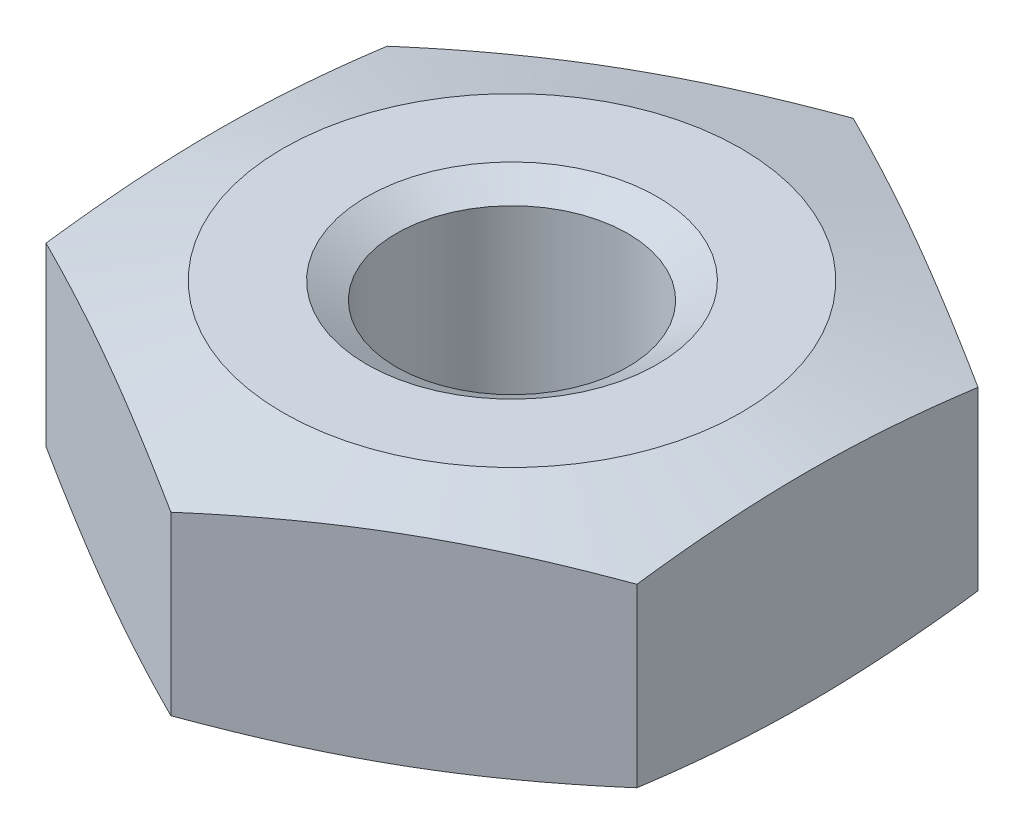
ISO-10303-21;
HEADER;
FILE_DESCRIPTION(('STEP AP214'),'2;1');
FILE_NAME('part.step','',(''),(''),'','','');
FILE_SCHEMA(('AUTOMOTIVE_DESIGN { 1 0 10303 214 1 1 1 1 }'));
ENDSEC;
DATA;
#1=APPLICATION_CONTEXT('core data for automotive mechanical design processes');
#2=APPLICATION_PROTOCOL_DEFINITION('international standard','automotive_design',2000,#1);
#3=PRODUCT_CONTEXT('',#1,'mechanical');
#4=PRODUCT('Part','Part','',(#3));
#5=PRODUCT_RELATED_PRODUCT_CATEGORY('part','',(#4));
#6=PRODUCT_DEFINITION_FORMATION('','',#4);
#7=PRODUCT_DEFINITION_CONTEXT('part definition',#1,'design');
#8=PRODUCT_DEFINITION('design','',#6,#7);
#9=PRODUCT_DEFINITION_SHAPE('','',#8);
#10=(LENGTH_UNIT() NAMED_UNIT(*) SI_UNIT(.MILLI.,.METRE.));
#11=(NAMED_UNIT(*) PLANE_ANGLE_UNIT() SI_UNIT($,.RADIAN.));
#12=(NAMED_UNIT(*) SI_UNIT($,.STERADIAN.) SOLID_ANGLE_UNIT());
#13=UNCERTAINTY_MEASURE_WITH_UNIT(LENGTH_MEASURE(1.E-05),#10,'distance_accuracy_value','');
#14=(GEOMETRIC_REPRESENTATION_CONTEXT(3) GLOBAL_UNCERTAINTY_ASSIGNED_CONTEXT((#13)) GLOBAL_UNIT_ASSIGNED_CONTEXT((#10,
#11,#12)) REPRESENTATION_CONTEXT('',''));
#15=CARTESIAN_POINT('',(0.,0.,0.));
#16=DIRECTION('',(0.,0.,1.));
#17=DIRECTION('',(1.,0.,0.));
#18=AXIS2_PLACEMENT_3D('',#15,#16,#17);
#19=CARTESIAN_POINT('',(2.,-0.8,-1.15470053837923));
#20=DIRECTION('',(-1.,0.,0.));
#21=DIRECTION('',(0.,0.,1.));
#22=AXIS2_PLACEMENT_3D('',#19,#20,#21);
#23=PLANE('',#22);
#24=CARTESIAN_POINT('',(1.99999999999997,0.141401210251661,3.47324861667428));
#25=CARTESIAN_POINT('',(1.99999999999997,0.160940611016028,3.3890936486832));
#26=CARTESIAN_POINT('',(1.99999999999997,0.180315705775737,3.30490054066797));
#27=CARTESIAN_POINT('',(1.99999999999996,0.218666868861422,3.13642208522566));
#28=CARTESIAN_POINT('',(1.99999999999997,0.23764293057746,3.05213673629492));
#29=CARTESIAN_POINT('',(1.99999999999997,0.293873377293213,2.79908926674104));
#30=CARTESIAN_POINT('',(1.99999999999997,0.330422252460475,2.63016894201641));
#31=CARTESIAN_POINT('',(1.99999999999997,0.401121323227892,2.29018152307641));
#32=CARTESIAN_POINT('',(1.99999999999997,0.435246030323585,2.11910908018931));
#33=CARTESIAN_POINT('',(1.99999999999998,0.499358491215547,1.77616039050156));
#34=CARTESIAN_POINT('',(1.99999999999998,0.529345890430285,1.60428407610985));
#35=CARTESIAN_POINT('',(1.99999999999998,0.582395558806895,1.264186479253));
#36=CARTESIAN_POINT('',(1.99999999999998,0.605622705089442,1.09599155406965));
#37=CARTESIAN_POINT('',(1.99999999999998,0.643619993830858,0.758643108449423));
#38=CARTESIAN_POINT('',(1.99999999999999,0.658392810002713,0.589489908180469));
#39=CARTESIAN_POINT('',(1.99999999999999,0.672380698873224,0.335682855885147));
#40=CARTESIAN_POINT('',(1.99999999999999,0.675683040364849,0.251248263840001));
#41=CARTESIAN_POINT('',(1.99999999999999,0.679442523828146,0.0823134970074466));
#42=CARTESIAN_POINT('',(1.99999999999999,0.679899678459578,-0.00218667748647597));
#43=CARTESIAN_POINT('',(1.99999999999999,0.677940099019386,-0.171157278962484));
#44=CARTESIAN_POINT('',(1.99999999999999,0.675523216204663,-0.255627704178596));
#45=CARTESIAN_POINT('',(2.,0.667942025179153,-0.424446461991346));
#46=CARTESIAN_POINT('',(2.,0.662777588436086,-0.508794788691024));
#47=CARTESIAN_POINT('',(2.,0.64719338979575,-0.713370271919349));
#48=CARTESIAN_POINT('',(2.,0.635470294867189,-0.833498119388903));
#49=CARTESIAN_POINT('',(2.,0.607830899802382,-1.07325134848211));
#50=CARTESIAN_POINT('',(2.,0.591914764628074,-1.19287674968486));
#51=CARTESIAN_POINT('',(2.,0.556763765063508,-1.43201365097653));
#52=CARTESIAN_POINT('',(2.,0.53751868779834,-1.55152362763628));
#53=CARTESIAN_POINT('',(2.,0.496531295604209,-1.79011542775252));
#54=CARTESIAN_POINT('',(2.00000000000001,0.474788858313548,-1.90919722993493));
#55=CARTESIAN_POINT('',(2.00000000000001,0.428955102291408,-2.14943338234408));
#56=CARTESIAN_POINT('',(2.00000000000001,0.404824801366345,-2.27058023847957));
#57=CARTESIAN_POINT('',(2.00000000000001,0.355083694392917,-2.51256928405234));
#58=CARTESIAN_POINT('',(2.00000000000001,0.329472872058284,-2.63341147012285));
#59=CARTESIAN_POINT('',(2.00000000000001,0.277268298844412,-2.87420001792743));
#60=CARTESIAN_POINT('',(2.00000000000001,0.250680592994023,-2.99414769646664));
#61=CARTESIAN_POINT('',(2.00000000000002,0.196634477720379,-3.23383822338097));
#62=CARTESIAN_POINT('',(2.00000000000002,0.169176129295292,-3.35358108548895));
#63=CARTESIAN_POINT('',(2.00000000000003,0.141401210251662,-3.47324861667424));
#64=B_SPLINE_CURVE_WITH_KNOTS('',3,(#24,#25,#26,#27,#28,#29,#30,#31,#32,#33,#34,#35,#36,#37,#38,
#39,#40,#41,#42,#43,#44,#45,#46,#47,#48,#49,#50,#51,#52,#53,#54,#55,#56,#57,#58,#59,#60,#61,#62,
#63),.UNSPECIFIED.,.F.,.F.,(4,2,2,2,2,2,2,2,2,2,2,2,2,2,2,2,2,2,2,4),(0.,0.259180308738312,
0.518364907393337,1.03683644692275,1.56013308467464,2.08347454292815,2.59270950514507,
3.10178333080936,3.35523857644573,3.60869269432316,3.86215993005044,4.11563902417542,
4.47763636286725,4.83961946204229,5.20273345223413,5.56586524130659,5.93643310809131,
6.30700505203223,6.67557873146188,7.04412664502861),.UNSPECIFIED.);
#65=CARTESIAN_POINT('',(2.,0.596519094751234,1.15470053837927));
#66=VERTEX_POINT('',#65);
#67=CARTESIAN_POINT('',(2.,0.596519094751236,-1.15470053837924));
#68=VERTEX_POINT('',#67);
#69=EDGE_CURVE('E85',#66,#68,#64,.T.);
#70=ORIENTED_EDGE('',*,*,#69,.F.);
#71=DIRECTION('',(0.,1.,0.));
#72=VECTOR('',#71,1.);
#73=CARTESIAN_POINT('',(2.,-0.8,1.15470053837927));
#74=LINE('',#73,#72);
#75=CARTESIAN_POINT('',(2.,-0.596519094751236,1.15470053837927));
#76=VERTEX_POINT('',#75);
#77=EDGE_CURVE('E11',#76,#66,#74,.T.);
#78=ORIENTED_EDGE('',*,*,#77,.F.);
#79=CARTESIAN_POINT('',(2.00000000000003,-0.141401210251661,-3.47324861667424));
#80=CARTESIAN_POINT('',(2.00000000000002,-0.160940611016028,-3.38909364868317));
#81=CARTESIAN_POINT('',(2.00000000000002,-0.180315705775737,-3.30490054066794));
#82=CARTESIAN_POINT('',(2.00000000000002,-0.218666868861421,-3.13642208522563));
#83=CARTESIAN_POINT('',(2.00000000000001,-0.23764293057746,-3.05213673629489));
#84=CARTESIAN_POINT('',(2.00000000000001,-0.293873377293213,-2.79908926674101));
#85=CARTESIAN_POINT('',(2.00000000000001,-0.330422252460475,-2.63016894201638));
#86=CARTESIAN_POINT('',(2.00000000000001,-0.401121323227891,-2.29018152307638));
#87=CARTESIAN_POINT('',(2.00000000000001,-0.435246030323585,-2.11910908018928));
#88=CARTESIAN_POINT('',(2.,-0.499358491215547,-1.77616039050153));
#89=CARTESIAN_POINT('',(2.,-0.529345890430284,-1.60428407610982));
#90=CARTESIAN_POINT('',(2.,-0.582395558806895,-1.26418647925297));
#91=CARTESIAN_POINT('',(2.,-0.605622705089442,-1.09599155406962));
#92=CARTESIAN_POINT('',(2.,-0.643619993830858,-0.758643108449392));
#93=CARTESIAN_POINT('',(2.,-0.658392810002713,-0.589489908180437));
#94=CARTESIAN_POINT('',(1.99999999999999,-0.672380698873224,-0.335682855885116));
#95=CARTESIAN_POINT('',(1.99999999999999,-0.675683040364849,-0.251248263839969));
#96=CARTESIAN_POINT('',(1.99999999999999,-0.679442523828146,-0.0823134970074147));
#97=CARTESIAN_POINT('',(1.99999999999999,-0.679899678459578,0.00218667748650792));
#98=CARTESIAN_POINT('',(1.99999999999999,-0.677940099019386,0.171157278962516));
#99=CARTESIAN_POINT('',(1.99999999999999,-0.675523216204663,0.255627704178628));
#100=CARTESIAN_POINT('',(1.99999999999999,-0.667942025179153,0.424446461991378));
#101=CARTESIAN_POINT('',(2.,-0.662777588436086,0.508794788691056));
#102=CARTESIAN_POINT('',(2.,-0.64719338979575,0.713370271919381));
#103=CARTESIAN_POINT('',(1.99999999999999,-0.635470294867189,0.833498119388935));
#104=CARTESIAN_POINT('',(1.99999999999998,-0.607830899802382,1.07325134848214));
#105=CARTESIAN_POINT('',(1.99999999999998,-0.591914764628074,1.19287674968489));
#106=CARTESIAN_POINT('',(1.99999999999998,-0.556763765063508,1.43201365097656));
#107=CARTESIAN_POINT('',(1.99999999999998,-0.53751868779834,1.55152362763631));
#108=CARTESIAN_POINT('',(1.99999999999998,-0.49653129560421,1.79011542775255));
#109=CARTESIAN_POINT('',(1.99999999999998,-0.474788858313548,1.90919722993496));
#110=CARTESIAN_POINT('',(1.99999999999997,-0.428955102291408,2.14943338234411));
#111=CARTESIAN_POINT('',(1.99999999999997,-0.404824801366345,2.2705802384796));
#112=CARTESIAN_POINT('',(1.99999999999997,-0.355083694392918,2.51256928405237));
#113=CARTESIAN_POINT('',(1.99999999999997,-0.329472872058284,2.63341147012289));
#114=CARTESIAN_POINT('',(1.99999999999997,-0.277268298844413,2.87420001792746));
#115=CARTESIAN_POINT('',(1.99999999999997,-0.250680592994024,2.99414769646667));
#116=CARTESIAN_POINT('',(1.99999999999997,-0.19663447772038,3.233838223381));
#117=CARTESIAN_POINT('',(1.99999999999997,-0.169176129295292,3.35358108548898));
#118=CARTESIAN_POINT('',(1.99999999999997,-0.141401210251661,3.47324861667428));
#119=B_SPLINE_CURVE_WITH_KNOTS('',3,(#79,#80,#81,#82,#83,#84,#85,#86,#87,#88,#89,#90,#91,#92,
#93,#94,#95,#96,#97,#98,#99,#100,#101,#102,#103,#104,#105,#106,#107,#108,#109,#110,#111,#112,
#113,#114,#115,#116,#117,#118),.UNSPECIFIED.,.F.,.F.,(4,2,2,2,2,2,2,2,2,2,2,2,2,2,2,2,2,2,2,4),
(0.,0.259180308738313,0.518364907393337,1.03683644692275,1.56013308467464,2.08347454292815,
2.59270950514507,3.10178333080936,3.35523857644573,3.60869269432316,3.86215993005044,
4.11563902417542,4.47763636286725,4.83961946204229,5.20273345223413,5.56586524130659,
5.93643310809132,6.30700505203223,6.67557873146188,7.04412664502861),.UNSPECIFIED.);
#120=CARTESIAN_POINT('',(2.,-0.596519094751234,-1.15470053837923));
#121=VERTEX_POINT('',#120);
#122=EDGE_CURVE('E216',#121,#76,#119,.T.);
#123=ORIENTED_EDGE('',*,*,#122,.F.);
#124=DIRECTION('',(0.,1.,0.));
#125=VECTOR('',#124,1.);
#126=CARTESIAN_POINT('',(2.,-0.8,-1.15470053837923));
#127=LINE('',#126,#125);
#128=EDGE_CURVE('E226',#121,#68,#127,.T.);
#129=ORIENTED_EDGE('',*,*,#128,.T.);
#130=EDGE_LOOP('',(#70,#78,#123,#129));
#131=FACE_BOUND('',#130,.T.);
#132=ADVANCED_FACE('F18',(#131),#23,.F.);
#133=CARTESIAN_POINT('',(2.,-0.8,1.15470053837927));
#134=DIRECTION('',(-0.5,0.,-0.866025403784442));
#135=DIRECTION('',(-0.866025403784442,0.,0.5));
#136=AXIS2_PLACEMENT_3D('',#133,#134,#135);
#137=PLANE('',#136);
#138=CARTESIAN_POINT('',(-0.0002,0.596488152323168,2.30951654681234));
#139=CARTESIAN_POINT('',(0.0828715258103755,0.609346147470084,2.26155517902373));
#140=CARTESIAN_POINT('',(0.166093692788135,0.621019185445748,2.21350683851658));
#141=CARTESIAN_POINT('',(0.332831998987835,0.641527739560567,2.11724043254797));
#142=CARTESIAN_POINT('',(0.41634824377756,0.650362102583379,2.06902230613691));
#143=CARTESIAN_POINT('',(0.583168226444386,0.664677454594242,1.97270874423801));
#144=CARTESIAN_POINT('',(0.666470835726329,0.670175519107848,1.92461396034488));
#145=CARTESIAN_POINT('',(0.833182312470906,0.677547872779877,1.8283630443694));
#146=CARTESIAN_POINT('',(0.916591156235455,0.679422863405992,1.78020692596915));
#147=CARTESIAN_POINT('',(1.08340884376455,0.679422863405992,1.68389468916863));
#148=CARTESIAN_POINT('',(1.1668176875291,0.677547872779877,1.63573857076837));
#149=CARTESIAN_POINT('',(1.33352916427368,0.670175519107848,1.53948765479289));
#150=CARTESIAN_POINT('',(1.41683177355562,0.664677454594241,1.49139287089976));
#151=CARTESIAN_POINT('',(1.58365175622245,0.650362102583379,1.39507930900086));
#152=CARTESIAN_POINT('',(1.66716800101217,0.641527739560567,1.34686118258981));
#153=CARTESIAN_POINT('',(1.83390630721187,0.621019185445748,1.25059477662119));
#154=CARTESIAN_POINT('',(1.91712847418963,0.609346147470083,1.20254643611404));
#155=CARTESIAN_POINT('',(2.0002,0.596488152323166,1.15458506832543));
#156=B_SPLINE_CURVE_WITH_KNOTS('',3,(#138,#139,#140,#141,#142,#143,#144,#145,#146,#147,#148,
#149,#150,#151,#152,#153,#154,#155),.UNSPECIFIED.,.F.,.F.,(4,2,2,2,2,2,2,2,4),(0.,
0.290357249044669,0.58083229729391,0.869807841095767,1.15872743038697,1.44764701967817,
1.73662256348003,2.02709761172927,2.31745486077394),.UNSPECIFIED.);
#157=CARTESIAN_POINT('',(0.,0.596519094751236,2.30940107675849));
#158=VERTEX_POINT('',#157);
#159=EDGE_CURVE('E35',#158,#66,#156,.T.);
#160=ORIENTED_EDGE('',*,*,#159,.F.);
#161=DIRECTION('',(0.,1.,0.));
#162=VECTOR('',#161,1.);
#163=CARTESIAN_POINT('',(0.,-0.8,2.30940107675849));
#164=LINE('',#163,#162);
#165=CARTESIAN_POINT('',(0.,-0.596519094751236,2.30940107675849));
#166=VERTEX_POINT('',#165);
#167=EDGE_CURVE('E27',#166,#158,#164,.T.);
#168=ORIENTED_EDGE('',*,*,#167,.F.);
#169=CARTESIAN_POINT('',(2.0002,-0.596488152323166,1.15458506832543));
#170=CARTESIAN_POINT('',(1.91712847418963,-0.609346147470083,1.20254643611404));
#171=CARTESIAN_POINT('',(1.83390630721187,-0.621019185445748,1.25059477662119));
#172=CARTESIAN_POINT('',(1.66716800101217,-0.641527739560567,1.34686118258981));
#173=CARTESIAN_POINT('',(1.58365175622245,-0.650362102583379,1.39507930900086));
#174=CARTESIAN_POINT('',(1.41683177355562,-0.664677454594241,1.49139287089976));
#175=CARTESIAN_POINT('',(1.33352916427368,-0.670175519107848,1.53948765479289));
#176=CARTESIAN_POINT('',(1.1668176875291,-0.677547872779877,1.63573857076837));
#177=CARTESIAN_POINT('',(1.08340884376455,-0.679422863405992,1.68389468916863));
#178=CARTESIAN_POINT('',(0.916591156235455,-0.679422863405992,1.78020692596915));
#179=CARTESIAN_POINT('',(0.833182312470906,-0.677547872779877,1.8283630443694));
#180=CARTESIAN_POINT('',(0.666470835726329,-0.670175519107848,1.92461396034488));
#181=CARTESIAN_POINT('',(0.583168226444386,-0.664677454594242,1.97270874423801));
#182=CARTESIAN_POINT('',(0.41634824377756,-0.650362102583379,2.06902230613691));
#183=CARTESIAN_POINT('',(0.332831998987835,-0.641527739560567,2.11724043254797));
#184=CARTESIAN_POINT('',(0.166093692788135,-0.621019185445748,2.21350683851658));
#185=CARTESIAN_POINT('',(0.0828715258103753,-0.609346147470084,2.26155517902373));
#186=CARTESIAN_POINT('',(-0.000200000000000463,-0.596488152323168,2.30951654681234));
#187=B_SPLINE_CURVE_WITH_KNOTS('',3,(#169,#170,#171,#172,#173,#174,#175,#176,#177,#178,#179,
#180,#181,#182,#183,#184,#185,#186),.UNSPECIFIED.,.F.,.F.,(4,2,2,2,2,2,2,2,4),(0.,
0.290357249044669,0.580832297293911,0.869807841095767,1.15872743038697,1.44764701967817,
1.73662256348003,2.02709761172927,2.31745486077394),.UNSPECIFIED.);
#188=EDGE_CURVE('E211',#76,#166,#187,.T.);
#189=ORIENTED_EDGE('',*,*,#188,.F.);
#190=ORIENTED_EDGE('',*,*,#77,.T.);
#191=EDGE_LOOP('',(#160,#168,#189,#190));
#192=FACE_BOUND('',#191,.T.);
#193=ADVANCED_FACE('F82',(#192),#137,.F.);
#194=CARTESIAN_POINT('',(0.,-0.8,2.30940107675849));
#195=DIRECTION('',(0.5,0.,-0.866025403784439));
#196=DIRECTION('',(-0.866025403784439,0.,-0.5));
#197=AXIS2_PLACEMENT_3D('',#194,#195,#196);
#198=PLANE('',#197);
#199=CARTESIAN_POINT('',(-2.0002,0.596488152323165,1.1545850683254));
#200=CARTESIAN_POINT('',(-1.91712847418963,0.609346147470085,1.20254643611401));
#201=CARTESIAN_POINT('',(-1.83390630721187,0.62101918544575,1.25059477662117));
#202=CARTESIAN_POINT('',(-1.66716800101217,0.64152773956057,1.34686118258979));
#203=CARTESIAN_POINT('',(-1.58365175622245,0.650362102583382,1.39507930900084));
#204=CARTESIAN_POINT('',(-1.41683177355562,0.664677454594245,1.49139287089974));
#205=CARTESIAN_POINT('',(-1.33352916427368,0.670175519107852,1.53948765479287));
#206=CARTESIAN_POINT('',(-1.1668176875291,0.677547872779881,1.63573857076835));
#207=CARTESIAN_POINT('',(-1.08340884376455,0.679422863405996,1.68389468916861));
#208=CARTESIAN_POINT('',(-0.916591156235452,0.679422863405996,1.78020692596913));
#209=CARTESIAN_POINT('',(-0.833182312470902,0.677547872779881,1.82836304436938));
#210=CARTESIAN_POINT('',(-0.666470835726325,0.670175519107853,1.92461396034487));
#211=CARTESIAN_POINT('',(-0.583168226444382,0.664677454594246,1.97270874423799));
#212=CARTESIAN_POINT('',(-0.416348243777554,0.650362102583383,2.0690223061369));
#213=CARTESIAN_POINT('',(-0.332831998987828,0.641527739560571,2.11724043254795));
#214=CARTESIAN_POINT('',(-0.166093692788129,0.621019185445752,2.21350683851657));
#215=CARTESIAN_POINT('',(-0.0828715258103714,0.609346147470087,2.26155517902372));
#216=CARTESIAN_POINT('',(0.000199999999999511,0.596488152323168,2.30951654681234));
#217=B_SPLINE_CURVE_WITH_KNOTS('',3,(#199,#200,#201,#202,#203,#204,#205,#206,#207,#208,#209,
#210,#211,#212,#213,#214,#215,#216),.UNSPECIFIED.,.F.,.F.,(4,2,2,2,2,2,2,2,4),(0.,
0.290357249044671,0.580832297293914,0.869807841095773,1.15872743038698,1.44764701967818,
1.73662256348004,2.02709761172928,2.31745486077395),.UNSPECIFIED.);
#218=CARTESIAN_POINT('',(-2.,0.596519094751236,1.15470053837922));
#219=VERTEX_POINT('',#218);
#220=EDGE_CURVE('E71',#219,#158,#217,.T.);
#221=ORIENTED_EDGE('',*,*,#220,.F.);
#222=DIRECTION('',(0.,1.,0.));
#223=VECTOR('',#222,1.);
#224=CARTESIAN_POINT('',(-2.,-0.8,1.15470053837924));
#225=LINE('',#224,#223);
#226=CARTESIAN_POINT('',(-2.,-0.596519094751236,1.15470053837922));
#227=VERTEX_POINT('',#226);
#228=EDGE_CURVE('E90',#227,#219,#225,.T.);
#229=ORIENTED_EDGE('',*,*,#228,.F.);
#230=CARTESIAN_POINT('',(0.000200000000000057,-0.596488152323168,2.30951654681234));
#231=CARTESIAN_POINT('',(-0.0828715258103708,-0.609346147470087,2.26155517902372));
#232=CARTESIAN_POINT('',(-0.166093692788129,-0.621019185445752,2.21350683851657));
#233=CARTESIAN_POINT('',(-0.332831998987828,-0.641527739560571,2.11724043254795));
#234=CARTESIAN_POINT('',(-0.416348243777554,-0.650362102583383,2.0690223061369));
#235=CARTESIAN_POINT('',(-0.583168226444382,-0.664677454594246,1.97270874423799));
#236=CARTESIAN_POINT('',(-0.666470835726325,-0.670175519107853,1.92461396034487));
#237=CARTESIAN_POINT('',(-0.833182312470902,-0.677547872779882,1.82836304436938));
#238=CARTESIAN_POINT('',(-0.916591156235452,-0.679422863405996,1.78020692596913));
#239=CARTESIAN_POINT('',(-1.08340884376455,-0.679422863405996,1.68389468916861));
#240=CARTESIAN_POINT('',(-1.1668176875291,-0.677547872779881,1.63573857076835));
#241=CARTESIAN_POINT('',(-1.33352916427368,-0.670175519107852,1.53948765479287));
#242=CARTESIAN_POINT('',(-1.41683177355562,-0.664677454594245,1.49139287089974));
#243=CARTESIAN_POINT('',(-1.58365175622245,-0.650362102583382,1.39507930900084));
#244=CARTESIAN_POINT('',(-1.66716800101217,-0.641527739560571,1.34686118258979));
#245=CARTESIAN_POINT('',(-1.83390630721187,-0.62101918544575,1.25059477662117));
#246=CARTESIAN_POINT('',(-1.91712847418963,-0.609346147470085,1.20254643611401));
#247=CARTESIAN_POINT('',(-2.0002,-0.596488152323165,1.1545850683254));
#248=B_SPLINE_CURVE_WITH_KNOTS('',3,(#230,#231,#232,#233,#234,#235,#236,#237,#238,#239,#240,
#241,#242,#243,#244,#245,#246,#247),.UNSPECIFIED.,.F.,.F.,(4,2,2,2,2,2,2,2,4),(0.,
0.290357249044671,0.580832297293914,0.869807841095773,1.15872743038698,1.44764701967818,
1.73662256348004,2.02709761172928,2.31745486077395),.UNSPECIFIED.);
#249=EDGE_CURVE('E89',#166,#227,#248,.T.);
#250=ORIENTED_EDGE('',*,*,#249,.F.);
#251=ORIENTED_EDGE('',*,*,#167,.T.);
#252=EDGE_LOOP('',(#221,#229,#250,#251));
#253=FACE_BOUND('',#252,.T.);
#254=ADVANCED_FACE('F88',(#253),#198,.F.);
#255=CARTESIAN_POINT('',(-2.,-0.8,1.15470053837924));
#256=DIRECTION('',(1.,0.,0.));
#257=DIRECTION('',(0.,0.,-1.));
#258=AXIS2_PLACEMENT_3D('',#255,#256,#257);
#259=PLANE('',#258);
#260=CARTESIAN_POINT('',(-1.99999999999997,0.141401210251659,-3.47324861667428));
#261=CARTESIAN_POINT('',(-1.99999999999996,0.160940611016027,-3.38909364868321));
#262=CARTESIAN_POINT('',(-1.99999999999996,0.180315705775735,-3.30490054066798));
#263=CARTESIAN_POINT('',(-1.99999999999996,0.21866686886142,-3.13642208522567));
#264=CARTESIAN_POINT('',(-1.99999999999996,0.237642930577459,-3.05213673629493));
#265=CARTESIAN_POINT('',(-1.99999999999996,0.293873377293212,-2.79908926674105));
#266=CARTESIAN_POINT('',(-1.99999999999997,0.330422252460474,-2.63016894201642));
#267=CARTESIAN_POINT('',(-1.99999999999997,0.40112132322789,-2.29018152307642));
#268=CARTESIAN_POINT('',(-1.99999999999997,0.435246030323584,-2.11910908018932));
#269=CARTESIAN_POINT('',(-1.99999999999997,0.499358491215546,-1.77616039050157));
#270=CARTESIAN_POINT('',(-1.99999999999997,0.529345890430284,-1.60428407610986));
#271=CARTESIAN_POINT('',(-1.99999999999998,0.582395558806895,-1.26418647925301));
#272=CARTESIAN_POINT('',(-1.99999999999998,0.605622705089441,-1.09599155406965));
#273=CARTESIAN_POINT('',(-1.99999999999998,0.643619993830858,-0.758643108449429));
#274=CARTESIAN_POINT('',(-1.99999999999998,0.658392810002713,-0.589489908180475));
#275=CARTESIAN_POINT('',(-1.99999999999999,0.672380698873224,-0.335682855885153));
#276=CARTESIAN_POINT('',(-1.99999999999999,0.675683040364849,-0.251248263840006));
#277=CARTESIAN_POINT('',(-1.99999999999999,0.679442523828146,-0.0823134970074515));
#278=CARTESIAN_POINT('',(-1.99999999999999,0.679899678459578,0.00218667748647126));
#279=CARTESIAN_POINT('',(-1.99999999999999,0.677940099019386,0.17115727896248));
#280=CARTESIAN_POINT('',(-1.99999999999999,0.675523216204663,0.255627704178592));
#281=CARTESIAN_POINT('',(-1.99999999999999,0.667942025179153,0.424446461991342));
#282=CARTESIAN_POINT('',(-2.,0.662777588436086,0.50879478869102));
#283=CARTESIAN_POINT('',(-2.,0.64719338979575,0.713370271919345));
#284=CARTESIAN_POINT('',(-2.,0.635470294867189,0.833498119388901));
#285=CARTESIAN_POINT('',(-2.,0.607830899802382,1.07325134848211));
#286=CARTESIAN_POINT('',(-2.,0.591914764628073,1.19287674968486));
#287=CARTESIAN_POINT('',(-2.,0.556763765063508,1.43201365097653));
#288=CARTESIAN_POINT('',(-2.,0.53751868779834,1.55152362763628));
#289=CARTESIAN_POINT('',(-2.00000000000001,0.496531295604209,1.79011542775252));
#290=CARTESIAN_POINT('',(-2.00000000000001,0.474788858313547,1.90919722993493));
#291=CARTESIAN_POINT('',(-2.00000000000001,0.428955102291407,2.14943338234408));
#292=CARTESIAN_POINT('',(-2.00000000000001,0.404824801366343,2.27058023847958));
#293=CARTESIAN_POINT('',(-2.00000000000001,0.355083694392916,2.51256928405234));
#294=CARTESIAN_POINT('',(-2.00000000000001,0.329472872058282,2.63341147012286));
#295=CARTESIAN_POINT('',(-2.00000000000002,0.27726829884441,2.87420001792744));
#296=CARTESIAN_POINT('',(-2.00000000000002,0.250680592994021,2.99414769646665));
#297=CARTESIAN_POINT('',(-2.00000000000002,0.196634477720376,3.23383822338098));
#298=CARTESIAN_POINT('',(-2.00000000000003,0.169176129295288,3.35358108548896));
#299=CARTESIAN_POINT('',(-2.00000000000004,0.141401210251658,3.47324861667426));
#300=B_SPLINE_CURVE_WITH_KNOTS('',3,(#260,#261,#262,#263,#264,#265,#266,#267,#268,#269,#270,
#271,#272,#273,#274,#275,#276,#277,#278,#279,#280,#281,#282,#283,#284,#285,#286,#287,#288,#289,
#290,#291,#292,#293,#294,#295,#296,#297,#298,#299),.UNSPECIFIED.,.F.,.F.,(4,2,2,2,2,2,2,2,2,2,2,
2,2,2,2,2,2,2,2,4),(0.,0.259180308738313,0.518364907393338,1.03683644692275,1.56013308467465,
2.08347454292816,2.59270950514508,3.10178333080936,3.35523857644574,3.60869269432316,
3.86215993005044,4.11563902417542,4.47763636286725,4.8396194620423,5.20273345223414,
5.5658652413066,5.93643310809133,6.30700505203225,6.6755787314619,7.04412664502863),.UNSPECIFIED.);
#301=CARTESIAN_POINT('',(-2.,0.596519094751235,-1.15470053837927));
#302=VERTEX_POINT('',#301);
#303=EDGE_CURVE('E74',#302,#219,#300,.T.);
#304=ORIENTED_EDGE('',*,*,#303,.F.);
#305=DIRECTION('',(0.,1.,0.));
#306=VECTOR('',#305,1.);
#307=CARTESIAN_POINT('',(-2.,-0.8,-1.15470053837927));
#308=LINE('',#307,#306);
#309=CARTESIAN_POINT('',(-2.,-0.596519094751235,-1.15470053837927));
#310=VERTEX_POINT('',#309);
#311=EDGE_CURVE('E92',#310,#302,#308,.T.);
#312=ORIENTED_EDGE('',*,*,#311,.F.);
#313=CARTESIAN_POINT('',(-2.00000000000004,-0.141401210251657,3.47324861667426));
#314=CARTESIAN_POINT('',(-2.00000000000003,-0.160940611016025,3.38909364868318));
#315=CARTESIAN_POINT('',(-2.00000000000002,-0.180315705775734,3.30490054066795));
#316=CARTESIAN_POINT('',(-2.00000000000002,-0.218666868861419,3.13642208522564));
#317=CARTESIAN_POINT('',(-2.00000000000002,-0.237642930577457,3.0521367362949));
#318=CARTESIAN_POINT('',(-2.00000000000002,-0.29387337729321,2.79908926674102));
#319=CARTESIAN_POINT('',(-2.00000000000001,-0.330422252460473,2.63016894201639));
#320=CARTESIAN_POINT('',(-2.00000000000001,-0.401121323227889,2.29018152307639));
#321=CARTESIAN_POINT('',(-2.00000000000001,-0.435246030323583,2.11910908018929));
#322=CARTESIAN_POINT('',(-2.00000000000001,-0.499358491215546,1.77616039050153));
#323=CARTESIAN_POINT('',(-2.,-0.529345890430283,1.60428407610983));
#324=CARTESIAN_POINT('',(-2.,-0.582395558806894,1.26418647925298));
#325=CARTESIAN_POINT('',(-2.,-0.605622705089441,1.09599155406962));
#326=CARTESIAN_POINT('',(-2.,-0.643619993830858,0.758643108449395));
#327=CARTESIAN_POINT('',(-1.99999999999999,-0.658392810002712,0.58948990818044));
#328=CARTESIAN_POINT('',(-1.99999999999999,-0.672380698873224,0.335682855885118));
#329=CARTESIAN_POINT('',(-1.99999999999999,-0.675683040364849,0.251248263839971));
#330=CARTESIAN_POINT('',(-1.99999999999999,-0.679442523828146,0.0823134970074165));
#331=CARTESIAN_POINT('',(-1.99999999999999,-0.679899678459579,-0.0021866774865063));
#332=CARTESIAN_POINT('',(-1.99999999999999,-0.677940099019386,-0.171157278962515));
#333=CARTESIAN_POINT('',(-1.99999999999998,-0.675523216204663,-0.255627704178627));
#334=CARTESIAN_POINT('',(-1.99999999999999,-0.667942025179153,-0.424446461991378));
#335=CARTESIAN_POINT('',(-2.,-0.662777588436086,-0.508794788691055));
#336=CARTESIAN_POINT('',(-2.,-0.64719338979575,-0.713370271919381));
#337=CARTESIAN_POINT('',(-1.99999999999999,-0.63547029486719,-0.833498119388936));
#338=CARTESIAN_POINT('',(-1.99999999999997,-0.607830899802383,-1.07325134848214));
#339=CARTESIAN_POINT('',(-1.99999999999998,-0.591914764628074,-1.1928767496849));
#340=CARTESIAN_POINT('',(-1.99999999999998,-0.556763765063508,-1.43201365097656));
#341=CARTESIAN_POINT('',(-1.99999999999998,-0.53751868779834,-1.55152362763632));
#342=CARTESIAN_POINT('',(-1.99999999999997,-0.496531295604209,-1.79011542775255));
#343=CARTESIAN_POINT('',(-1.99999999999997,-0.474788858313548,-1.90919722993496));
#344=CARTESIAN_POINT('',(-1.99999999999997,-0.428955102291408,-2.14943338234411));
#345=CARTESIAN_POINT('',(-1.99999999999997,-0.404824801366344,-2.27058023847961));
#346=CARTESIAN_POINT('',(-1.99999999999997,-0.355083694392917,-2.51256928405237));
#347=CARTESIAN_POINT('',(-1.99999999999997,-0.329472872058283,-2.63341147012289));
#348=CARTESIAN_POINT('',(-1.99999999999996,-0.277268298844411,-2.87420001792747));
#349=CARTESIAN_POINT('',(-1.99999999999996,-0.250680592994023,-2.99414769646668));
#350=CARTESIAN_POINT('',(-1.99999999999996,-0.196634477720378,-3.23383822338101));
#351=CARTESIAN_POINT('',(-1.99999999999996,-0.16917612929529,-3.35358108548899));
#352=CARTESIAN_POINT('',(-1.99999999999997,-0.14140121025166,-3.47324861667428));
#353=B_SPLINE_CURVE_WITH_KNOTS('',3,(#313,#314,#315,#316,#317,#318,#319,#320,#321,#322,#323,
#324,#325,#326,#327,#328,#329,#330,#331,#332,#333,#334,#335,#336,#337,#338,#339,#340,#341,#342,
#343,#344,#345,#346,#347,#348,#349,#350,#351,#352),.UNSPECIFIED.,.F.,.F.,(4,2,2,2,2,2,2,2,2,2,2,
2,2,2,2,2,2,2,2,4),(0.,0.259180308738313,0.518364907393338,1.03683644692275,1.56013308467465,
2.08347454292816,2.59270950514508,3.10178333080937,3.35523857644574,3.60869269432317,
3.86215993005045,4.11563902417543,4.47763636286726,4.8396194620423,5.20273345223414,
5.56586524130661,5.93643310809133,6.30700505203225,6.6755787314619,7.04412664502863),.UNSPECIFIED.);
#354=EDGE_CURVE('E198',#227,#310,#353,.T.);
#355=ORIENTED_EDGE('',*,*,#354,.F.);
#356=ORIENTED_EDGE('',*,*,#228,.T.);
#357=EDGE_LOOP('',(#304,#312,#355,#356));
#358=FACE_BOUND('',#357,.T.);
#359=ADVANCED_FACE('F240',(#358),#259,.F.);
#360=CARTESIAN_POINT('',(-2.,-0.8,-1.15470053837927));
#361=DIRECTION('',(0.499999999999994,0.,0.866025403784443));
#362=DIRECTION('',(0.866025403784443,0.,-0.499999999999994));
#363=AXIS2_PLACEMENT_3D('',#360,#361,#362);
#364=PLANE('',#363);
#365=CARTESIAN_POINT('',(0.000200000000015506,0.596488152323166,-2.30951654681234));
#366=CARTESIAN_POINT('',(-0.082871525810358,0.609346147470084,-2.26155517902373));
#367=CARTESIAN_POINT('',(-0.166093692788117,0.621019185445749,-2.21350683851658));
#368=CARTESIAN_POINT('',(-0.332831998987817,0.641527739560568,-2.11724043254796));
#369=CARTESIAN_POINT('',(-0.416348243777543,0.65036210258338,-2.06902230613691));
#370=CARTESIAN_POINT('',(-0.583168226444372,0.664677454594243,-1.97270874423801));
#371=CARTESIAN_POINT('',(-0.666470835726315,0.67017551910785,-1.92461396034488));
#372=CARTESIAN_POINT('',(-0.833182312470894,0.677547872779879,-1.8283630443694));
#373=CARTESIAN_POINT('',(-0.916591156235443,0.679422863405993,-1.78020692596914));
#374=CARTESIAN_POINT('',(-1.08340884376454,0.679422863405993,-1.68389468916863));
#375=CARTESIAN_POINT('',(-1.16681768752909,0.677547872779878,-1.63573857076837));
#376=CARTESIAN_POINT('',(-1.33352916427367,0.670175519107849,-1.53948765479289));
#377=CARTESIAN_POINT('',(-1.41683177355561,0.664677454594243,-1.49139287089976));
#378=CARTESIAN_POINT('',(-1.58365175622244,0.65036210258338,-1.39507930900086));
#379=CARTESIAN_POINT('',(-1.66716800101217,0.641527739560567,-1.34686118258981));
#380=CARTESIAN_POINT('',(-1.83390630721187,0.621019185445748,-1.25059477662119));
#381=CARTESIAN_POINT('',(-1.91712847418963,0.609346147470083,-1.20254643611404));
#382=CARTESIAN_POINT('',(-2.0002,0.596488152323166,-1.15458506832543));
#383=B_SPLINE_CURVE_WITH_KNOTS('',3,(#365,#366,#367,#368,#369,#370,#371,#372,#373,#374,#375,
#376,#377,#378,#379,#380,#381,#382),.UNSPECIFIED.,.F.,.F.,(4,2,2,2,2,2,2,2,4),(0.,
0.290357249044671,0.580832297293915,0.869807841095773,1.15872743038698,1.44764701967818,
1.73662256348004,2.02709761172928,2.31745486077395),.UNSPECIFIED.);
#384=CARTESIAN_POINT('',(0.,0.596519094751236,-2.30940107675849));
#385=VERTEX_POINT('',#384);
#386=EDGE_CURVE('E119',#385,#302,#383,.T.);
#387=ORIENTED_EDGE('',*,*,#386,.F.);
#388=DIRECTION('',(0.,1.,0.));
#389=VECTOR('',#388,1.);
#390=CARTESIAN_POINT('',(0.,-0.8,-2.30940107675851));
#391=LINE('',#390,#389);
#392=CARTESIAN_POINT('',(0.,-0.596519094751236,-2.30940107675849));
#393=VERTEX_POINT('',#392);
#394=EDGE_CURVE('E229',#393,#385,#391,.T.);
#395=ORIENTED_EDGE('',*,*,#394,.F.);
#396=CARTESIAN_POINT('',(-2.0002,-0.596488152323166,-1.15458506832543));
#397=CARTESIAN_POINT('',(-1.91712847418963,-0.609346147470084,-1.20254643611404));
#398=CARTESIAN_POINT('',(-1.83390630721187,-0.621019185445748,-1.25059477662119));
#399=CARTESIAN_POINT('',(-1.66716800101217,-0.641527739560568,-1.34686118258981));
#400=CARTESIAN_POINT('',(-1.58365175622244,-0.65036210258338,-1.39507930900086));
#401=CARTESIAN_POINT('',(-1.41683177355561,-0.664677454594242,-1.49139287089976));
#402=CARTESIAN_POINT('',(-1.33352916427367,-0.670175519107849,-1.53948765479289));
#403=CARTESIAN_POINT('',(-1.16681768752909,-0.677547872779878,-1.63573857076837));
#404=CARTESIAN_POINT('',(-1.08340884376454,-0.679422863405993,-1.68389468916863));
#405=CARTESIAN_POINT('',(-0.916591156235443,-0.679422863405994,-1.78020692596914));
#406=CARTESIAN_POINT('',(-0.833182312470894,-0.677547872779879,-1.8283630443694));
#407=CARTESIAN_POINT('',(-0.666470835726315,-0.67017551910785,-1.92461396034488));
#408=CARTESIAN_POINT('',(-0.583168226444372,-0.664677454594243,-1.97270874423801));
#409=CARTESIAN_POINT('',(-0.416348243777543,-0.650362102583381,-2.06902230613691));
#410=CARTESIAN_POINT('',(-0.332831998987817,-0.641527739560568,-2.11724043254796));
#411=CARTESIAN_POINT('',(-0.166093692788117,-0.621019185445749,-2.21350683851658));
#412=CARTESIAN_POINT('',(-0.0828715258103583,-0.609346147470084,-2.26155517902373));
#413=CARTESIAN_POINT('',(0.000200000000014899,-0.596488152323166,-2.30951654681234));
#414=B_SPLINE_CURVE_WITH_KNOTS('',3,(#396,#397,#398,#399,#400,#401,#402,#403,#404,#405,#406,
#407,#408,#409,#410,#411,#412,#413),.UNSPECIFIED.,.F.,.F.,(4,2,2,2,2,2,2,2,4),(0.,
0.290357249044671,0.580832297293914,0.869807841095772,1.15872743038698,1.44764701967818,
1.73662256348004,2.02709761172928,2.31745486077395),.UNSPECIFIED.);
#415=EDGE_CURVE('E177',#310,#393,#414,.T.);
#416=ORIENTED_EDGE('',*,*,#415,.F.);
#417=ORIENTED_EDGE('',*,*,#311,.T.);
#418=EDGE_LOOP('',(#387,#395,#416,#417));
#419=FACE_BOUND('',#418,.T.);
#420=ADVANCED_FACE('F236',(#419),#364,.F.);
#421=CARTESIAN_POINT('',(0.,-0.8,-2.30940107675851));
#422=DIRECTION('',(-0.500000000000007,0.,0.866025403784434));
#423=DIRECTION('',(0.866025403784435,0.,0.500000000000007));
#424=AXIS2_PLACEMENT_3D('',#421,#422,#423);
#425=PLANE('',#424);
#426=CARTESIAN_POINT('',(2.0002,0.596488152323167,-1.15458506832539));
#427=CARTESIAN_POINT('',(1.91712847418963,0.609346147470086,-1.20254643611401));
#428=CARTESIAN_POINT('',(1.83390630721188,0.62101918544575,-1.25059477662116));
#429=CARTESIAN_POINT('',(1.66716800101218,0.64152773956057,-1.34686118258979));
#430=CARTESIAN_POINT('',(1.58365175622245,0.650362102583382,-1.39507930900084));
#431=CARTESIAN_POINT('',(1.41683177355563,0.664677454594244,-1.49139287089974));
#432=CARTESIAN_POINT('',(1.33352916427368,0.670175519107851,-1.53948765479287));
#433=CARTESIAN_POINT('',(1.16681768752911,0.67754787277988,-1.63573857076835));
#434=CARTESIAN_POINT('',(1.08340884376456,0.679422863405995,-1.68389468916861));
#435=CARTESIAN_POINT('',(0.916591156235462,0.679422863405994,-1.78020692596913));
#436=CARTESIAN_POINT('',(0.833182312470913,0.677547872779879,-1.82836304436939));
#437=CARTESIAN_POINT('',(0.666470835726337,0.67017551910785,-1.92461396034487));
#438=CARTESIAN_POINT('',(0.583168226444395,0.664677454594244,-1.972708744238));
#439=CARTESIAN_POINT('',(0.416348243777568,0.650362102583381,-2.0690223061369));
#440=CARTESIAN_POINT('',(0.332831998987843,0.641527739560569,-2.11724043254796));
#441=CARTESIAN_POINT('',(0.166093692788145,0.621019185445749,-2.21350683851658));
#442=CARTESIAN_POINT('',(0.0828715258103872,0.609346147470084,-2.26155517902373));
#443=CARTESIAN_POINT('',(-0.000199999999984597,0.596488152323166,-2.30951654681234));
#444=B_SPLINE_CURVE_WITH_KNOTS('',3,(#426,#427,#428,#429,#430,#431,#432,#433,#434,#435,#436,
#437,#438,#439,#440,#441,#442,#443),.UNSPECIFIED.,.F.,.F.,(4,2,2,2,2,2,2,2,4),(0.,
0.29035724904467,0.580832297293912,0.869807841095769,1.15872743038697,1.44764701967817,
1.73662256348003,2.02709761172927,2.31745486077394),.UNSPECIFIED.);
#445=EDGE_CURVE('E102',#68,#385,#444,.T.);
#446=ORIENTED_EDGE('',*,*,#445,.F.);
#447=ORIENTED_EDGE('',*,*,#128,.F.);
#448=CARTESIAN_POINT('',(-0.000199999999984395,-0.596488152323166,-2.30951654681234));
#449=CARTESIAN_POINT('',(0.0828715258103874,-0.609346147470084,-2.26155517902373));
#450=CARTESIAN_POINT('',(0.166093692788145,-0.621019185445749,-2.21350683851658));
#451=CARTESIAN_POINT('',(0.332831998987843,-0.641527739560569,-2.11724043254796));
#452=CARTESIAN_POINT('',(0.416348243777568,-0.650362102583381,-2.0690223061369));
#453=CARTESIAN_POINT('',(0.583168226444395,-0.664677454594244,-1.972708744238));
#454=CARTESIAN_POINT('',(0.666470835726337,-0.67017551910785,-1.92461396034487));
#455=CARTESIAN_POINT('',(0.833182312470913,-0.677547872779879,-1.82836304436939));
#456=CARTESIAN_POINT('',(0.916591156235462,-0.679422863405994,-1.78020692596913));
#457=CARTESIAN_POINT('',(1.08340884376456,-0.679422863405995,-1.68389468916861));
#458=CARTESIAN_POINT('',(1.16681768752911,-0.67754787277988,-1.63573857076835));
#459=CARTESIAN_POINT('',(1.33352916427368,-0.670175519107851,-1.53948765479287));
#460=CARTESIAN_POINT('',(1.41683177355563,-0.664677454594244,-1.49139287089974));
#461=CARTESIAN_POINT('',(1.58365175622245,-0.650362102583382,-1.39507930900084));
#462=CARTESIAN_POINT('',(1.66716800101218,-0.64152773956057,-1.34686118258979));
#463=CARTESIAN_POINT('',(1.83390630721188,-0.62101918544575,-1.25059477662116));
#464=CARTESIAN_POINT('',(1.91712847418963,-0.609346147470085,-1.20254643611401));
#465=CARTESIAN_POINT('',(2.0002,-0.596488152323166,-1.15458506832539));
#466=B_SPLINE_CURVE_WITH_KNOTS('',3,(#448,#449,#450,#451,#452,#453,#454,#455,#456,#457,#458,
#459,#460,#461,#462,#463,#464,#465),.UNSPECIFIED.,.F.,.F.,(4,2,2,2,2,2,2,2,4),(0.,
0.29035724904467,0.580832297293912,0.869807841095769,1.15872743038697,1.44764701967817,
1.73662256348003,2.02709761172927,2.31745486077394),.UNSPECIFIED.);
#467=EDGE_CURVE('E43',#393,#121,#466,.T.);
#468=ORIENTED_EDGE('',*,*,#467,.F.);
#469=ORIENTED_EDGE('',*,*,#394,.T.);
#470=EDGE_LOOP('',(#446,#447,#468,#469));
#471=FACE_BOUND('',#470,.T.);
#472=ADVANCED_FACE('F20',(#471),#425,.F.);
#473=CARTESIAN_POINT('',(0.,-0.8,0.));
#474=DIRECTION('',(0.,1.,0.));
#475=DIRECTION('',(-1.,0.,0.));
#476=AXIS2_PLACEMENT_3D('',#473,#474,#475);
#477=CONICAL_SURFACE('',#476,1.55,1.30899693899575);
#478=ORIENTED_EDGE('',*,*,#188,.T.);
#479=ORIENTED_EDGE('',*,*,#249,.T.);
#480=ORIENTED_EDGE('',*,*,#354,.T.);
#481=ORIENTED_EDGE('',*,*,#415,.T.);
#482=ORIENTED_EDGE('',*,*,#467,.T.);
#483=ORIENTED_EDGE('',*,*,#122,.T.);
#484=EDGE_LOOP('',(#478,#479,#480,#481,#482,#483));
#485=FACE_BOUND('',#484,.T.);
#486=CARTESIAN_POINT('',(0.,-0.8,0.));
#487=DIRECTION('',(0.,-1.,0.));
#488=DIRECTION('',(1.,0.,0.));
#489=AXIS2_PLACEMENT_3D('',#486,#487,#488);
#490=CIRCLE('',#489,1.55);
#491=CARTESIAN_POINT('',(1.55,-0.8,0.));
#492=VERTEX_POINT('',#491);
#493=EDGE_CURVE('E168',#492,#492,#490,.T.);
#494=ORIENTED_EDGE('',*,*,#493,.F.);
#495=EDGE_LOOP('',(#494));
#496=FACE_BOUND('',#495,.T.);
#497=ADVANCED_FACE('F186',(#485,#496),#477,.T.);
#498=CARTESIAN_POINT('',(0.,-0.8,0.));
#499=DIRECTION('',(0.,-1.,0.));
#500=DIRECTION('',(0.,0.,-1.));
#501=AXIS2_PLACEMENT_3D('',#498,#499,#500);
#502=PLANE('',#501);
#503=CARTESIAN_POINT('',(0.,-0.8,0.));
#504=DIRECTION('',(0.,1.,0.));
#505=DIRECTION('',(0.,0.,1.));
#506=AXIS2_PLACEMENT_3D('',#503,#504,#505);
#507=CIRCLE('',#506,0.9835);
#508=CARTESIAN_POINT('',(0.,-0.8,0.9835));
#509=VERTEX_POINT('',#508);
#510=EDGE_CURVE('E98',#509,#509,#507,.T.);
#511=ORIENTED_EDGE('',*,*,#510,.T.);
#512=EDGE_LOOP('',(#511));
#513=FACE_BOUND('',#512,.T.);
#514=ORIENTED_EDGE('',*,*,#493,.T.);
#515=EDGE_LOOP('',(#514));
#516=FACE_BOUND('',#515,.T.);
#517=ADVANCED_FACE('F133',(#513,#516),#502,.T.);
#518=CARTESIAN_POINT('',(0.,0.596519094751236,0.));
#519=DIRECTION('',(0.,-1.,0.));
#520=DIRECTION('',(1.,0.,0.));
#521=AXIS2_PLACEMENT_3D('',#518,#519,#520);
#522=CONICAL_SURFACE('',#521,2.30940107675849,1.30899693899575);
#523=CARTESIAN_POINT('',(0.,0.8,0.));
#524=DIRECTION('',(0.,-1.,0.));
#525=DIRECTION('',(1.,0.,0.));
#526=AXIS2_PLACEMENT_3D('',#523,#524,#525);
#527=CIRCLE('',#526,1.55);
#528=CARTESIAN_POINT('',(1.55,0.8,0.));
#529=VERTEX_POINT('',#528);
#530=EDGE_CURVE('E97',#529,#529,#527,.T.);
#531=ORIENTED_EDGE('',*,*,#530,.T.);
#532=EDGE_LOOP('',(#531));
#533=FACE_BOUND('',#532,.T.);
#534=ORIENTED_EDGE('',*,*,#69,.T.);
#535=ORIENTED_EDGE('',*,*,#445,.T.);
#536=ORIENTED_EDGE('',*,*,#386,.T.);
#537=ORIENTED_EDGE('',*,*,#303,.T.);
#538=ORIENTED_EDGE('',*,*,#220,.T.);
#539=ORIENTED_EDGE('',*,*,#159,.T.);
#540=EDGE_LOOP('',(#534,#535,#536,#537,#538,#539));
#541=FACE_BOUND('',#540,.T.);
#542=ADVANCED_FACE('F72',(#533,#541),#522,.T.);
#543=CARTESIAN_POINT('',(0.,0.8,0.));
#544=DIRECTION('',(0.,-1.,0.));
#545=DIRECTION('',(0.,0.,-1.));
#546=AXIS2_PLACEMENT_3D('',#543,#544,#545);
#547=PLANE('',#546);
#548=CARTESIAN_POINT('',(0.,0.8,0.));
#549=DIRECTION('',(0.,-1.,0.));
#550=DIRECTION('',(0.,0.,1.));
#551=AXIS2_PLACEMENT_3D('',#548,#549,#550);
#552=CIRCLE('',#551,0.9835);
#553=CARTESIAN_POINT('',(0.,0.8,0.9835));
#554=VERTEX_POINT('',#553);
#555=EDGE_CURVE('E109',#554,#554,#552,.T.);
#556=ORIENTED_EDGE('',*,*,#555,.T.);
#557=EDGE_LOOP('',(#556));
#558=FACE_BOUND('',#557,.T.);
#559=ORIENTED_EDGE('',*,*,#530,.F.);
#560=EDGE_LOOP('',(#559));
#561=FACE_BOUND('',#560,.T.);
#562=ADVANCED_FACE('F132',(#558,#561),#547,.F.);
#563=CARTESIAN_POINT('',(0.,5.51611695057441,0.));
#564=DIRECTION('',(0.,-1.,0.));
#565=DIRECTION('',(0.,0.,-1.));
#566=AXIS2_PLACEMENT_3D('',#563,#564,#565);
#567=CYLINDRICAL_SURFACE('',#566,0.7835);
#568=CARTESIAN_POINT('',(0.,0.684529946162075,0.));
#569=DIRECTION('',(0.,1.,0.));
#570=DIRECTION('',(0.,0.,1.));
#571=AXIS2_PLACEMENT_3D('',#568,#569,#570);
#572=CIRCLE('',#571,0.7835);
#573=CARTESIAN_POINT('',(0.,0.684529946162075,0.7835));
#574=VERTEX_POINT('',#573);
#575=EDGE_CURVE('E22',#574,#574,#572,.T.);
#576=ORIENTED_EDGE('',*,*,#575,.T.);
#577=EDGE_LOOP('',(#576));
#578=FACE_BOUND('',#577,.T.);
#579=CARTESIAN_POINT('',(0.,-0.684529946162075,0.));
#580=DIRECTION('',(0.,-1.,0.));
#581=DIRECTION('',(0.,0.,-1.));
#582=AXIS2_PLACEMENT_3D('',#579,#580,#581);
#583=CIRCLE('',#582,0.7835);
#584=CARTESIAN_POINT('',(0.,-0.684529946162075,-0.7835));
#585=VERTEX_POINT('',#584);
#586=EDGE_CURVE('E95',#585,#585,#583,.T.);
#587=ORIENTED_EDGE('',*,*,#586,.T.);
#588=EDGE_LOOP('',(#587));
#589=FACE_BOUND('',#588,.T.);
#590=ADVANCED_FACE('F135',(#578,#589),#567,.F.);
#591=CARTESIAN_POINT('',(0.,-0.8,0.));
#592=DIRECTION('',(0.,-1.,0.));
#593=DIRECTION('',(0.,0.,1.));
#594=AXIS2_PLACEMENT_3D('',#591,#592,#593);
#595=CONICAL_SURFACE('',#594,0.9835,1.0471975511966);
#596=ORIENTED_EDGE('',*,*,#510,.F.);
#597=EDGE_LOOP('',(#596));
#598=FACE_BOUND('',#597,.T.);
#599=ORIENTED_EDGE('',*,*,#586,.F.);
#600=EDGE_LOOP('',(#599));
#601=FACE_BOUND('',#600,.T.);
#602=ADVANCED_FACE('F319',(#598,#601),#595,.F.);
#603=CARTESIAN_POINT('',(0.,0.8,0.));
#604=DIRECTION('',(0.,1.,0.));
#605=DIRECTION('',(0.,0.,1.));
#606=AXIS2_PLACEMENT_3D('',#603,#604,#605);
#607=CONICAL_SURFACE('',#606,0.9835,1.0471975511966);
#608=ORIENTED_EDGE('',*,*,#555,.F.);
#609=EDGE_LOOP('',(#608));
#610=FACE_BOUND('',#609,.T.);
#611=ORIENTED_EDGE('',*,*,#575,.F.);
#612=EDGE_LOOP('',(#611));
#613=FACE_BOUND('',#612,.T.);
#614=ADVANCED_FACE('F332',(#610,#613),#607,.F.);
#615=CLOSED_SHELL('',(#132,#193,#254,#359,#420,#472,#497,#517,#542,#562,#590,#602,#614));
#616=MANIFOLD_SOLID_BREP('B1',#615);
#617=ADVANCED_BREP_SHAPE_REPRESENTATION('',(#18,#616),#14);
#618=SHAPE_DEFINITION_REPRESENTATION(#9,#617);
ENDSEC;
END-ISO-10303-21;
